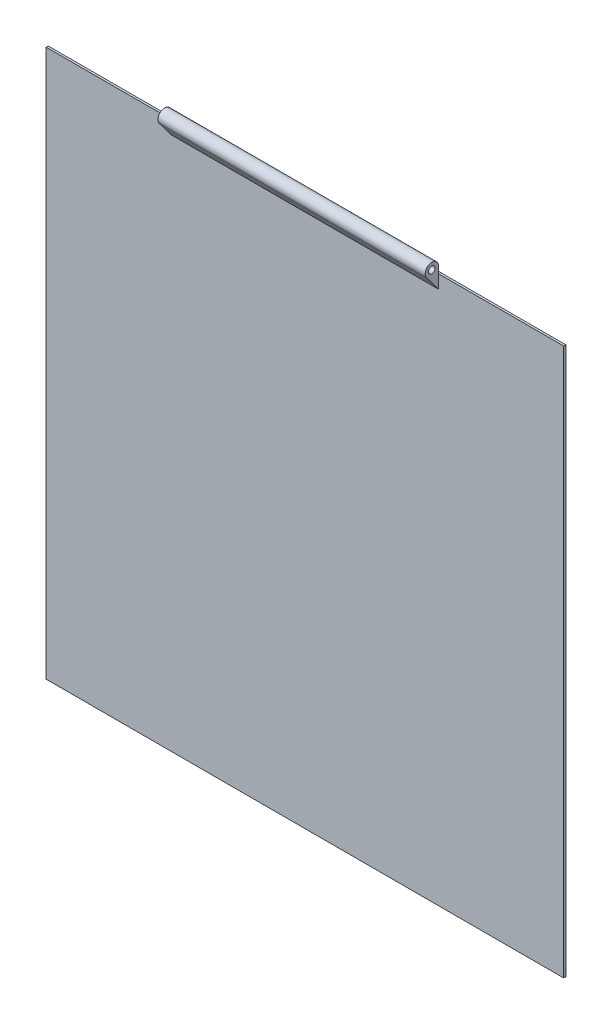
ISO-10303-21;
HEADER;
FILE_DESCRIPTION(('STEP AP214'),'2;1');
FILE_NAME('part.step','',(''),(''),'','','');
FILE_SCHEMA(('AUTOMOTIVE_DESIGN { 1 0 10303 214 1 1 1 1 }'));
ENDSEC;
DATA;
#1=APPLICATION_CONTEXT('core data for automotive mechanical design processes');
#2=APPLICATION_PROTOCOL_DEFINITION('international standard','automotive_design',2000,#1);
#3=PRODUCT_CONTEXT('',#1,'mechanical');
#4=PRODUCT('Part','Part','',(#3));
#5=PRODUCT_RELATED_PRODUCT_CATEGORY('part','',(#4));
#6=PRODUCT_DEFINITION_FORMATION('','',#4);
#7=PRODUCT_DEFINITION_CONTEXT('part definition',#1,'design');
#8=PRODUCT_DEFINITION('design','',#6,#7);
#9=PRODUCT_DEFINITION_SHAPE('','',#8);
#10=(LENGTH_UNIT() NAMED_UNIT(*) SI_UNIT(.MILLI.,.METRE.));
#11=(NAMED_UNIT(*) PLANE_ANGLE_UNIT() SI_UNIT($,.RADIAN.));
#12=(NAMED_UNIT(*) SI_UNIT($,.STERADIAN.) SOLID_ANGLE_UNIT());
#13=UNCERTAINTY_MEASURE_WITH_UNIT(LENGTH_MEASURE(1.E-05),#10,'distance_accuracy_value','');
#14=(GEOMETRIC_REPRESENTATION_CONTEXT(3) GLOBAL_UNCERTAINTY_ASSIGNED_CONTEXT((#13)) GLOBAL_UNIT_ASSIGNED_CONTEXT((#10,
#11,#12)) REPRESENTATION_CONTEXT('',''));
#15=CARTESIAN_POINT('',(0.,0.,0.));
#16=DIRECTION('',(0.,0.,1.));
#17=DIRECTION('',(1.,0.,0.));
#18=AXIS2_PLACEMENT_3D('',#15,#16,#17);
#19=CARTESIAN_POINT('',(0.,0.,1.5875));
#20=DIRECTION('',(0.,0.,1.));
#21=DIRECTION('',(1.,0.,0.));
#22=AXIS2_PLACEMENT_3D('',#19,#20,#21);
#23=PLANE('',#22);
#24=DIRECTION('',(1.,0.,0.));
#25=VECTOR('',#24,1.);
#26=CARTESIAN_POINT('',(-100.,-9.99999999999993,1.5875));
#27=LINE('',#26,#25);
#28=CARTESIAN_POINT('',(-100.,-9.99999999999993,1.5875));
#29=VERTEX_POINT('',#28);
#30=CARTESIAN_POINT('',(100.,-9.99999999999993,1.5875));
#31=VERTEX_POINT('',#30);
#32=EDGE_CURVE('E50',#29,#31,#27,.T.);
#33=ORIENTED_EDGE('',*,*,#32,.F.);
#34=DIRECTION('',(0.,1.,0.));
#35=VECTOR('',#34,1.);
#36=CARTESIAN_POINT('',(-100.,0.,1.5875));
#37=LINE('',#36,#35);
#38=CARTESIAN_POINT('',(-100.,0.,1.5875));
#39=VERTEX_POINT('',#38);
#40=EDGE_CURVE('E109',#29,#39,#37,.T.);
#41=ORIENTED_EDGE('',*,*,#40,.T.);
#42=DIRECTION('',(-1.,0.,0.));
#43=VECTOR('',#42,1.);
#44=CARTESIAN_POINT('',(-193.65,0.,1.5875));
#45=LINE('',#44,#43);
#46=CARTESIAN_POINT('',(-193.65,0.,1.5875));
#47=VERTEX_POINT('',#46);
#48=EDGE_CURVE('E150',#39,#47,#45,.T.);
#49=ORIENTED_EDGE('',*,*,#48,.T.);
#50=DIRECTION('',(0.,-1.,0.));
#51=VECTOR('',#50,1.);
#52=CARTESIAN_POINT('',(-193.65,0.,1.5875));
#53=LINE('',#52,#51);
#54=CARTESIAN_POINT('',(-193.65,-409.62,1.5875));
#55=VERTEX_POINT('',#54);
#56=EDGE_CURVE('E142',#47,#55,#53,.T.);
#57=ORIENTED_EDGE('',*,*,#56,.T.);
#58=DIRECTION('',(1.,0.,0.));
#59=VECTOR('',#58,1.);
#60=CARTESIAN_POINT('',(-193.65,-409.62,1.5875));
#61=LINE('',#60,#59);
#62=CARTESIAN_POINT('',(193.65,-409.62,1.5875));
#63=VERTEX_POINT('',#62);
#64=EDGE_CURVE('E145',#55,#63,#61,.T.);
#65=ORIENTED_EDGE('',*,*,#64,.T.);
#66=DIRECTION('',(0.,1.,0.));
#67=VECTOR('',#66,1.);
#68=CARTESIAN_POINT('',(193.65,0.,1.5875));
#69=LINE('',#68,#67);
#70=CARTESIAN_POINT('',(193.65,0.,1.5875));
#71=VERTEX_POINT('',#70);
#72=EDGE_CURVE('E148',#63,#71,#69,.T.);
#73=ORIENTED_EDGE('',*,*,#72,.T.);
#74=CARTESIAN_POINT('',(100.,0.,1.5875));
#75=VERTEX_POINT('',#74);
#76=EDGE_CURVE('E151',#71,#75,#45,.T.);
#77=ORIENTED_EDGE('',*,*,#76,.T.);
#78=DIRECTION('',(0.,1.,0.));
#79=VECTOR('',#78,1.);
#80=CARTESIAN_POINT('',(100.,0.,1.5875));
#81=LINE('',#80,#79);
#82=EDGE_CURVE('E55',#31,#75,#81,.T.);
#83=ORIENTED_EDGE('',*,*,#82,.F.);
#84=EDGE_LOOP('',(#33,#41,#49,#57,#65,#73,#77,#83));
#85=FACE_BOUND('',#84,.T.);
#86=ADVANCED_FACE('F35',(#85),#23,.T.);
#87=CARTESIAN_POINT('',(-193.65,0.,1.5875));
#88=DIRECTION('',(1.,0.,0.));
#89=DIRECTION('',(0.,1.,0.));
#90=AXIS2_PLACEMENT_3D('',#87,#88,#89);
#91=PLANE('',#90);
#92=DIRECTION('',(0.,-1.,0.));
#93=VECTOR('',#92,1.);
#94=CARTESIAN_POINT('',(-193.65,0.,0.));
#95=LINE('',#94,#93);
#96=CARTESIAN_POINT('',(-193.65,0.,0.));
#97=VERTEX_POINT('',#96);
#98=CARTESIAN_POINT('',(-193.65,-409.62,0.));
#99=VERTEX_POINT('',#98);
#100=EDGE_CURVE('E140',#97,#99,#95,.T.);
#101=ORIENTED_EDGE('',*,*,#100,.T.);
#102=DIRECTION('',(0.,0.,-1.));
#103=VECTOR('',#102,1.);
#104=CARTESIAN_POINT('',(-193.65,-409.62,1.5875));
#105=LINE('',#104,#103);
#106=EDGE_CURVE('E11',#55,#99,#105,.T.);
#107=ORIENTED_EDGE('',*,*,#106,.F.);
#108=ORIENTED_EDGE('',*,*,#56,.F.);
#109=DIRECTION('',(0.,0.,-1.));
#110=VECTOR('',#109,1.);
#111=CARTESIAN_POINT('',(-193.65,0.,1.5875));
#112=LINE('',#111,#110);
#113=EDGE_CURVE('E153',#47,#97,#112,.T.);
#114=ORIENTED_EDGE('',*,*,#113,.T.);
#115=EDGE_LOOP('',(#101,#107,#108,#114));
#116=FACE_BOUND('',#115,.T.);
#117=ADVANCED_FACE('F37',(#116),#91,.F.);
#118=CARTESIAN_POINT('',(-193.65,-409.62,1.5875));
#119=DIRECTION('',(0.,1.,0.));
#120=DIRECTION('',(-1.,0.,0.));
#121=AXIS2_PLACEMENT_3D('',#118,#119,#120);
#122=PLANE('',#121);
#123=DIRECTION('',(1.,0.,0.));
#124=VECTOR('',#123,1.);
#125=CARTESIAN_POINT('',(-193.65,-409.62,0.));
#126=LINE('',#125,#124);
#127=CARTESIAN_POINT('',(193.65,-409.62,0.));
#128=VERTEX_POINT('',#127);
#129=EDGE_CURVE('E156',#99,#128,#126,.T.);
#130=ORIENTED_EDGE('',*,*,#129,.T.);
#131=DIRECTION('',(0.,0.,-1.));
#132=VECTOR('',#131,1.);
#133=CARTESIAN_POINT('',(193.65,-409.62,1.5875));
#134=LINE('',#133,#132);
#135=EDGE_CURVE('E43',#63,#128,#134,.T.);
#136=ORIENTED_EDGE('',*,*,#135,.F.);
#137=ORIENTED_EDGE('',*,*,#64,.F.);
#138=ORIENTED_EDGE('',*,*,#106,.T.);
#139=EDGE_LOOP('',(#130,#136,#137,#138));
#140=FACE_BOUND('',#139,.T.);
#141=ADVANCED_FACE('F206',(#140),#122,.F.);
#142=CARTESIAN_POINT('',(193.65,0.,1.5875));
#143=DIRECTION('',(-1.,0.,0.));
#144=DIRECTION('',(0.,-1.,0.));
#145=AXIS2_PLACEMENT_3D('',#142,#143,#144);
#146=PLANE('',#145);
#147=DIRECTION('',(0.,1.,0.));
#148=VECTOR('',#147,1.);
#149=CARTESIAN_POINT('',(193.65,0.,0.));
#150=LINE('',#149,#148);
#151=CARTESIAN_POINT('',(193.65,0.,0.));
#152=VERTEX_POINT('',#151);
#153=EDGE_CURVE('E158',#128,#152,#150,.T.);
#154=ORIENTED_EDGE('',*,*,#153,.T.);
#155=DIRECTION('',(0.,0.,-1.));
#156=VECTOR('',#155,1.);
#157=CARTESIAN_POINT('',(193.65,0.,1.5875));
#158=LINE('',#157,#156);
#159=EDGE_CURVE('E163',#71,#152,#158,.T.);
#160=ORIENTED_EDGE('',*,*,#159,.F.);
#161=ORIENTED_EDGE('',*,*,#72,.F.);
#162=ORIENTED_EDGE('',*,*,#135,.T.);
#163=EDGE_LOOP('',(#154,#160,#161,#162));
#164=FACE_BOUND('',#163,.T.);
#165=ADVANCED_FACE('F170',(#164),#146,.F.);
#166=CARTESIAN_POINT('',(-193.65,0.,1.5875));
#167=DIRECTION('',(0.,-1.,0.));
#168=DIRECTION('',(1.,0.,0.));
#169=AXIS2_PLACEMENT_3D('',#166,#167,#168);
#170=PLANE('',#169);
#171=DIRECTION('',(-1.,0.,0.));
#172=VECTOR('',#171,1.);
#173=CARTESIAN_POINT('',(-193.65,0.,0.));
#174=LINE('',#173,#172);
#175=EDGE_CURVE('E146',#152,#97,#174,.T.);
#176=ORIENTED_EDGE('',*,*,#175,.T.);
#177=ORIENTED_EDGE('',*,*,#113,.F.);
#178=ORIENTED_EDGE('',*,*,#48,.F.);
#179=EDGE_CURVE('E106',#75,#39,#45,.T.);
#180=ORIENTED_EDGE('',*,*,#179,.F.);
#181=ORIENTED_EDGE('',*,*,#76,.F.);
#182=ORIENTED_EDGE('',*,*,#159,.T.);
#183=EDGE_LOOP('',(#176,#177,#178,#180,#181,#182));
#184=FACE_BOUND('',#183,.T.);
#185=ADVANCED_FACE('F179',(#184),#170,.F.);
#186=CARTESIAN_POINT('',(0.,0.,0.));
#187=DIRECTION('',(0.,0.,1.));
#188=DIRECTION('',(1.,0.,0.));
#189=AXIS2_PLACEMENT_3D('',#186,#187,#188);
#190=PLANE('',#189);
#191=ORIENTED_EDGE('',*,*,#100,.F.);
#192=ORIENTED_EDGE('',*,*,#175,.F.);
#193=ORIENTED_EDGE('',*,*,#153,.F.);
#194=ORIENTED_EDGE('',*,*,#129,.F.);
#195=EDGE_LOOP('',(#191,#192,#193,#194));
#196=FACE_BOUND('',#195,.T.);
#197=ADVANCED_FACE('F176',(#196),#190,.F.);
#198=CARTESIAN_POINT('',(-100.,0.,1.5875));
#199=DIRECTION('',(0.,0.,-1.));
#200=DIRECTION('',(-1.,0.,0.));
#201=AXIS2_PLACEMENT_3D('',#198,#199,#200);
#202=PLANE('',#201);
#203=ORIENTED_EDGE('',*,*,#179,.T.);
#204=CARTESIAN_POINT('',(-100.,5.,1.5875));
#205=VERTEX_POINT('',#204);
#206=EDGE_CURVE('E99',#39,#205,#37,.T.);
#207=ORIENTED_EDGE('',*,*,#206,.T.);
#208=DIRECTION('',(1.,0.,0.));
#209=VECTOR('',#208,1.);
#210=CARTESIAN_POINT('',(-100.,5.,1.5875));
#211=LINE('',#210,#209);
#212=CARTESIAN_POINT('',(100.,5.,1.5875));
#213=VERTEX_POINT('',#212);
#214=EDGE_CURVE('E103',#205,#213,#211,.T.);
#215=ORIENTED_EDGE('',*,*,#214,.T.);
#216=EDGE_CURVE('E132',#75,#213,#81,.T.);
#217=ORIENTED_EDGE('',*,*,#216,.F.);
#218=EDGE_LOOP('',(#203,#207,#215,#217));
#219=FACE_BOUND('',#218,.T.);
#220=ADVANCED_FACE('F101',(#219),#202,.T.);
#221=CARTESIAN_POINT('',(-100.,-4.362,5.81599999999997));
#222=DIRECTION('',(0.,-0.600000000000002,0.799999999999998));
#223=DIRECTION('',(0.,-0.799999999999998,-0.600000000000002));
#224=AXIS2_PLACEMENT_3D('',#221,#222,#223);
#225=PLANE('',#224);
#226=DIRECTION('',(0.,-0.799999999999998,-0.600000000000002));
#227=VECTOR('',#226,1.);
#228=CARTESIAN_POINT('',(100.,-4.362,5.81599999999997));
#229=LINE('',#228,#227);
#230=CARTESIAN_POINT('',(100.,2.,10.5875));
#231=VERTEX_POINT('',#230);
#232=EDGE_CURVE('E134',#231,#31,#229,.T.);
#233=ORIENTED_EDGE('',*,*,#232,.F.);
#234=DIRECTION('',(1.,0.,0.));
#235=VECTOR('',#234,1.);
#236=CARTESIAN_POINT('',(-100.,2.,10.5875));
#237=LINE('',#236,#235);
#238=CARTESIAN_POINT('',(-100.,2.,10.5875));
#239=VERTEX_POINT('',#238);
#240=EDGE_CURVE('E119',#239,#231,#237,.T.);
#241=ORIENTED_EDGE('',*,*,#240,.F.);
#242=DIRECTION('',(0.,-0.799999999999998,-0.600000000000002));
#243=VECTOR('',#242,1.);
#244=CARTESIAN_POINT('',(-100.,-4.362,5.81599999999997));
#245=LINE('',#244,#243);
#246=EDGE_CURVE('E125',#239,#29,#245,.T.);
#247=ORIENTED_EDGE('',*,*,#246,.T.);
#248=ORIENTED_EDGE('',*,*,#32,.T.);
#249=EDGE_LOOP('',(#233,#241,#247,#248));
#250=FACE_BOUND('',#249,.T.);
#251=ADVANCED_FACE('F190',(#250),#225,.T.);
#252=CARTESIAN_POINT('',(-100.,5.,6.5875));
#253=DIRECTION('',(1.,0.,0.));
#254=DIRECTION('',(0.,0.,-1.));
#255=AXIS2_PLACEMENT_3D('',#252,#253,#254);
#256=CYLINDRICAL_SURFACE('',#255,5.);
#257=CARTESIAN_POINT('',(100.,5.,6.5875));
#258=DIRECTION('',(1.,0.,0.));
#259=DIRECTION('',(0.,0.,-1.));
#260=AXIS2_PLACEMENT_3D('',#257,#258,#259);
#261=CIRCLE('',#260,5.);
#262=EDGE_CURVE('E118',#213,#231,#261,.T.);
#263=ORIENTED_EDGE('',*,*,#262,.F.);
#264=ORIENTED_EDGE('',*,*,#214,.F.);
#265=CARTESIAN_POINT('',(-100.,5.,6.5875));
#266=DIRECTION('',(1.,0.,0.));
#267=DIRECTION('',(0.,0.,-1.));
#268=AXIS2_PLACEMENT_3D('',#265,#266,#267);
#269=CIRCLE('',#268,5.);
#270=EDGE_CURVE('E115',#205,#239,#269,.T.);
#271=ORIENTED_EDGE('',*,*,#270,.T.);
#272=ORIENTED_EDGE('',*,*,#240,.T.);
#273=EDGE_LOOP('',(#263,#264,#271,#272));
#274=FACE_BOUND('',#273,.T.);
#275=ADVANCED_FACE('F114',(#274),#256,.T.);
#276=CARTESIAN_POINT('',(-100.,5.,6.5875));
#277=DIRECTION('',(1.,0.,0.));
#278=DIRECTION('',(0.,0.,-1.));
#279=AXIS2_PLACEMENT_3D('',#276,#277,#278);
#280=CYLINDRICAL_SURFACE('',#279,2.5);
#281=CARTESIAN_POINT('',(-100.,5.,6.5875));
#282=DIRECTION('',(1.,0.,0.));
#283=DIRECTION('',(0.,0.,-1.));
#284=AXIS2_PLACEMENT_3D('',#281,#282,#283);
#285=CIRCLE('',#284,2.5);
#286=CARTESIAN_POINT('',(-100.,5.,4.0875));
#287=VERTEX_POINT('',#286);
#288=EDGE_CURVE('E120',#287,#287,#285,.T.);
#289=ORIENTED_EDGE('',*,*,#288,.F.);
#290=EDGE_LOOP('',(#289));
#291=FACE_BOUND('',#290,.T.);
#292=CARTESIAN_POINT('',(100.,5.,6.5875));
#293=DIRECTION('',(1.,0.,0.));
#294=DIRECTION('',(0.,0.,-1.));
#295=AXIS2_PLACEMENT_3D('',#292,#293,#294);
#296=CIRCLE('',#295,2.5);
#297=CARTESIAN_POINT('',(100.,5.,4.0875));
#298=VERTEX_POINT('',#297);
#299=EDGE_CURVE('E110',#298,#298,#296,.T.);
#300=ORIENTED_EDGE('',*,*,#299,.T.);
#301=EDGE_LOOP('',(#300));
#302=FACE_BOUND('',#301,.T.);
#303=ADVANCED_FACE('F197',(#291,#302),#280,.F.);
#304=CARTESIAN_POINT('',(-100.,0.,0.));
#305=DIRECTION('',(1.,0.,0.));
#306=DIRECTION('',(0.,0.,-1.));
#307=AXIS2_PLACEMENT_3D('',#304,#305,#306);
#308=PLANE('',#307);
#309=ORIENTED_EDGE('',*,*,#40,.F.);
#310=ORIENTED_EDGE('',*,*,#246,.F.);
#311=ORIENTED_EDGE('',*,*,#270,.F.);
#312=ORIENTED_EDGE('',*,*,#206,.F.);
#313=EDGE_LOOP('',(#309,#310,#311,#312));
#314=FACE_BOUND('',#313,.T.);
#315=ORIENTED_EDGE('',*,*,#288,.T.);
#316=EDGE_LOOP('',(#315));
#317=FACE_BOUND('',#316,.T.);
#318=ADVANCED_FACE('F122',(#314,#317),#308,.F.);
#319=CARTESIAN_POINT('',(100.,0.,0.));
#320=DIRECTION('',(1.,0.,0.));
#321=DIRECTION('',(0.,0.,-1.));
#322=AXIS2_PLACEMENT_3D('',#319,#320,#321);
#323=PLANE('',#322);
#324=ORIENTED_EDGE('',*,*,#82,.T.);
#325=ORIENTED_EDGE('',*,*,#216,.T.);
#326=ORIENTED_EDGE('',*,*,#262,.T.);
#327=ORIENTED_EDGE('',*,*,#232,.T.);
#328=EDGE_LOOP('',(#324,#325,#326,#327));
#329=FACE_BOUND('',#328,.T.);
#330=ORIENTED_EDGE('',*,*,#299,.F.);
#331=EDGE_LOOP('',(#330));
#332=FACE_BOUND('',#331,.T.);
#333=ADVANCED_FACE('F186',(#329,#332),#323,.T.);
#334=CLOSED_SHELL('',(#86,#117,#141,#165,#185,#197,#220,#251,#275,#303,#318,#333));
#335=MANIFOLD_SOLID_BREP('B2',#334);
#336=ADVANCED_BREP_SHAPE_REPRESENTATION('',(#18,#335),#14);
#337=SHAPE_DEFINITION_REPRESENTATION(#9,#336);
ENDSEC;
END-ISO-10303-21;
